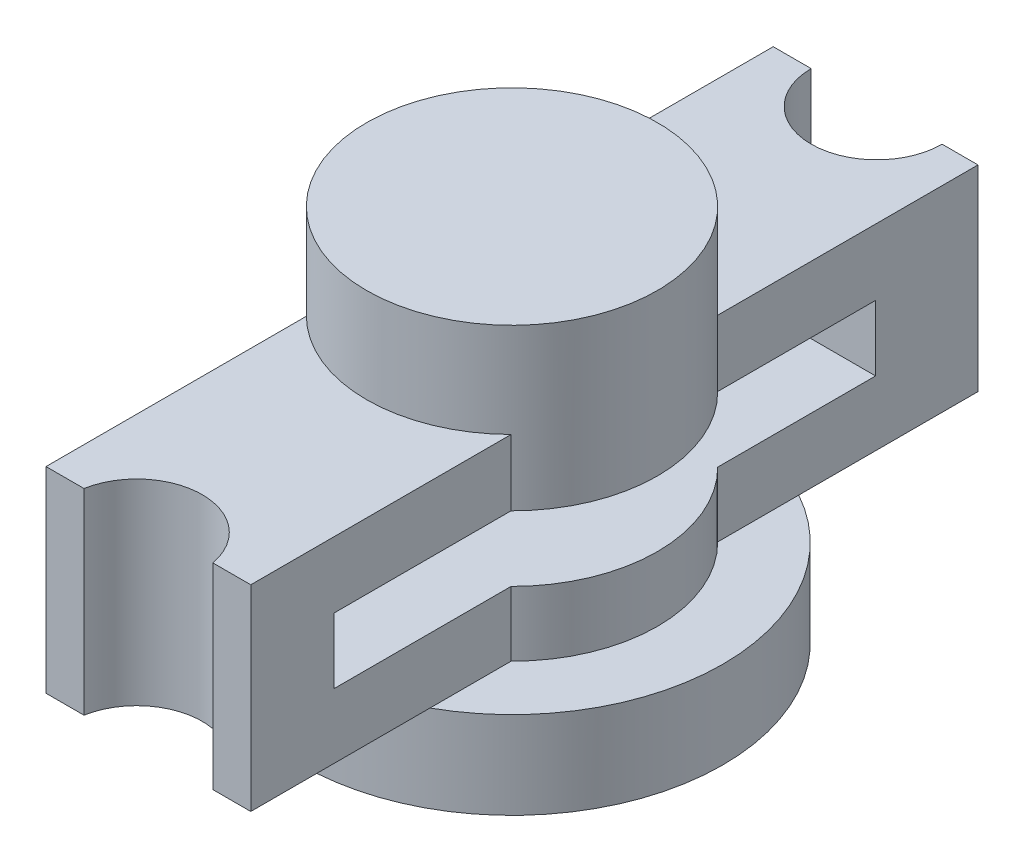
ISO-10303-21;
HEADER;
FILE_DESCRIPTION(('STEP AP214'),'2;1');
FILE_NAME('part.step','',(''),(''),'','','');
FILE_SCHEMA(('AUTOMOTIVE_DESIGN { 1 0 10303 214 1 1 1 1 }'));
ENDSEC;
DATA;
#1=APPLICATION_CONTEXT('core data for automotive mechanical design processes');
#2=APPLICATION_PROTOCOL_DEFINITION('international standard','automotive_design',2000,#1);
#3=PRODUCT_CONTEXT('',#1,'mechanical');
#4=PRODUCT('Part','Part','',(#3));
#5=PRODUCT_RELATED_PRODUCT_CATEGORY('part','',(#4));
#6=PRODUCT_DEFINITION_FORMATION('','',#4);
#7=PRODUCT_DEFINITION_CONTEXT('part definition',#1,'design');
#8=PRODUCT_DEFINITION('design','',#6,#7);
#9=PRODUCT_DEFINITION_SHAPE('','',#8);
#10=(LENGTH_UNIT() NAMED_UNIT(*) SI_UNIT(.MILLI.,.METRE.));
#11=(NAMED_UNIT(*) PLANE_ANGLE_UNIT() SI_UNIT($,.RADIAN.));
#12=(NAMED_UNIT(*) SI_UNIT($,.STERADIAN.) SOLID_ANGLE_UNIT());
#13=UNCERTAINTY_MEASURE_WITH_UNIT(LENGTH_MEASURE(1.E-05),#10,'distance_accuracy_value','');
#14=(GEOMETRIC_REPRESENTATION_CONTEXT(3) GLOBAL_UNCERTAINTY_ASSIGNED_CONTEXT((#13)) GLOBAL_UNIT_ASSIGNED_CONTEXT((#10,
#11,#12)) REPRESENTATION_CONTEXT('',''));
#15=CARTESIAN_POINT('',(0.,0.,0.));
#16=DIRECTION('',(0.,0.,1.));
#17=DIRECTION('',(1.,0.,0.));
#18=AXIS2_PLACEMENT_3D('',#15,#16,#17);
#19=CARTESIAN_POINT('',(0.,-52.,-1.04070291371448));
#20=DIRECTION('',(0.,1.,0.));
#21=DIRECTION('',(0.,0.,1.));
#22=AXIS2_PLACEMENT_3D('',#19,#20,#21);
#23=CYLINDRICAL_SURFACE('',#22,20.);
#24=DIRECTION('',(0.,-1.,0.));
#25=VECTOR('',#24,1.);
#26=CARTESIAN_POINT('',(14.0782722340498,-25.,13.1650089974846));
#27=LINE('',#26,#25);
#28=CARTESIAN_POINT('',(14.0782722340498,-25.,13.1650089974846));
#29=VERTEX_POINT('',#28);
#30=CARTESIAN_POINT('',(14.0782722340498,-34.0910702402835,13.1650089974846));
#31=VERTEX_POINT('',#30);
#32=EDGE_CURVE('E192',#29,#31,#27,.T.);
#33=ORIENTED_EDGE('',*,*,#32,.T.);
#34=CARTESIAN_POINT('',(0.,-34.0910702402835,-1.04070291371448));
#35=DIRECTION('',(0.,-1.,0.));
#36=DIRECTION('',(0.,0.,-1.));
#37=AXIS2_PLACEMENT_3D('',#34,#35,#36);
#38=CIRCLE('',#37,20.);
#39=CARTESIAN_POINT('',(14.0782722340497,-34.0910702402835,-15.2464148249136));
#40=VERTEX_POINT('',#39);
#41=EDGE_CURVE('E55',#31,#40,#38,.F.);
#42=ORIENTED_EDGE('',*,*,#41,.T.);
#43=DIRECTION('',(0.,-1.,0.));
#44=VECTOR('',#43,1.);
#45=CARTESIAN_POINT('',(14.0782722340498,-25.,-15.2464148249136));
#46=LINE('',#45,#44);
#47=CARTESIAN_POINT('',(14.0782722340498,-25.,-15.2464148249136));
#48=VERTEX_POINT('',#47);
#49=EDGE_CURVE('E189',#48,#40,#46,.T.);
#50=ORIENTED_EDGE('',*,*,#49,.F.);
#51=CARTESIAN_POINT('',(0.,-25.,-1.04070291371448));
#52=DIRECTION('',(0.,1.,0.));
#53=DIRECTION('',(0.,0.,1.));
#54=AXIS2_PLACEMENT_3D('',#51,#52,#53);
#55=CIRCLE('',#54,20.);
#56=CARTESIAN_POINT('',(-14.0782722340498,-25.,-15.2464148249136));
#57=VERTEX_POINT('',#56);
#58=EDGE_CURVE('E290',#57,#48,#55,.F.);
#59=ORIENTED_EDGE('',*,*,#58,.F.);
#60=DIRECTION('',(0.,-1.,0.));
#61=VECTOR('',#60,1.);
#62=CARTESIAN_POINT('',(-14.0782722340498,-25.,-15.2464148249136));
#63=LINE('',#62,#61);
#64=CARTESIAN_POINT('',(-14.0782722340498,-34.0910702402835,-15.2464148249136));
#65=VERTEX_POINT('',#64);
#66=EDGE_CURVE('E213',#57,#65,#63,.T.);
#67=ORIENTED_EDGE('',*,*,#66,.T.);
#68=CARTESIAN_POINT('',(0.,-34.0910702402835,-1.04070291371448));
#69=DIRECTION('',(0.,1.,0.));
#70=DIRECTION('',(0.,0.,1.));
#71=AXIS2_PLACEMENT_3D('',#68,#69,#70);
#72=CIRCLE('',#71,20.);
#73=CARTESIAN_POINT('',(-14.0782722340498,-34.0910702402835,13.1650089974846));
#74=VERTEX_POINT('',#73);
#75=EDGE_CURVE('E62',#74,#65,#72,.F.);
#76=ORIENTED_EDGE('',*,*,#75,.F.);
#77=DIRECTION('',(0.,-1.,0.));
#78=VECTOR('',#77,1.);
#79=CARTESIAN_POINT('',(-14.0782722340498,-25.,13.1650089974846));
#80=LINE('',#79,#78);
#81=CARTESIAN_POINT('',(-14.0782722340498,-25.,13.1650089974846));
#82=VERTEX_POINT('',#81);
#83=EDGE_CURVE('E258',#82,#74,#80,.T.);
#84=ORIENTED_EDGE('',*,*,#83,.F.);
#85=CARTESIAN_POINT('',(0.,-25.,-1.04070291371448));
#86=DIRECTION('',(0.,1.,0.));
#87=DIRECTION('',(0.,0.,1.));
#88=AXIS2_PLACEMENT_3D('',#85,#86,#87);
#89=CIRCLE('',#88,20.);
#90=EDGE_CURVE('E285',#29,#82,#89,.F.);
#91=ORIENTED_EDGE('',*,*,#90,.F.);
#92=EDGE_LOOP('',(#33,#42,#50,#59,#67,#76,#84,#91));
#93=FACE_BOUND('',#92,.T.);
#94=CARTESIAN_POINT('',(0.,-12.,-1.04070291371448));
#95=DIRECTION('',(0.,1.,0.));
#96=DIRECTION('',(0.,0.,1.));
#97=AXIS2_PLACEMENT_3D('',#94,#95,#96);
#98=CIRCLE('',#97,20.);
#99=CARTESIAN_POINT('',(0.,-12.,18.9592970862855));
#100=VERTEX_POINT('',#99);
#101=EDGE_CURVE('E43',#100,#100,#98,.F.);
#102=ORIENTED_EDGE('',*,*,#101,.T.);
#103=EDGE_LOOP('',(#102));
#104=FACE_BOUND('',#103,.T.);
#105=ADVANCED_FACE('F39',(#93,#104),#23,.T.);
#106=CARTESIAN_POINT('',(14.0782722340498,-43.0910702402835,-15.2464148249136));
#107=VERTEX_POINT('',#106);
#108=CARTESIAN_POINT('',(14.0782722340498,-52.,-15.2464148249136));
#109=VERTEX_POINT('',#108);
#110=EDGE_CURVE('E211',#107,#109,#46,.T.);
#111=ORIENTED_EDGE('',*,*,#110,.F.);
#112=CARTESIAN_POINT('',(0.,-43.0910702402835,-1.04070291371448));
#113=DIRECTION('',(0.,1.,0.));
#114=DIRECTION('',(0.,0.,1.));
#115=AXIS2_PLACEMENT_3D('',#112,#113,#114);
#116=CIRCLE('',#115,20.);
#117=CARTESIAN_POINT('',(14.0782722340497,-43.0910702402835,13.1650089974846));
#118=VERTEX_POINT('',#117);
#119=EDGE_CURVE('E193',#107,#118,#116,.F.);
#120=ORIENTED_EDGE('',*,*,#119,.T.);
#121=CARTESIAN_POINT('',(14.0782722340498,-52.,13.1650089974846));
#122=VERTEX_POINT('',#121);
#123=EDGE_CURVE('E261',#118,#122,#27,.T.);
#124=ORIENTED_EDGE('',*,*,#123,.T.);
#125=CARTESIAN_POINT('',(0.,-52.,-1.04070291371448));
#126=DIRECTION('',(0.,1.,0.));
#127=DIRECTION('',(0.,0.,1.));
#128=AXIS2_PLACEMENT_3D('',#125,#126,#127);
#129=CIRCLE('',#128,20.);
#130=EDGE_CURVE('E279',#122,#109,#129,.T.);
#131=ORIENTED_EDGE('',*,*,#130,.T.);
#132=EDGE_LOOP('',(#111,#120,#124,#131));
#133=FACE_BOUND('',#132,.T.);
#134=ADVANCED_FACE('F41',(#133),#23,.T.);
#135=CARTESIAN_POINT('',(0.,-43.0910702402835,-1.04070291371448));
#136=DIRECTION('',(0.,-1.,0.));
#137=DIRECTION('',(0.,0.,-1.));
#138=AXIS2_PLACEMENT_3D('',#135,#136,#137);
#139=CIRCLE('',#138,20.);
#140=CARTESIAN_POINT('',(-14.0782722340498,-43.0910702402835,-15.2464148249136));
#141=VERTEX_POINT('',#140);
#142=CARTESIAN_POINT('',(-14.0782722340498,-43.0910702402835,13.1650089974846));
#143=VERTEX_POINT('',#142);
#144=EDGE_CURVE('E336',#141,#143,#139,.F.);
#145=ORIENTED_EDGE('',*,*,#144,.F.);
#146=CARTESIAN_POINT('',(-14.0782722340498,-52.,-15.2464148249136));
#147=VERTEX_POINT('',#146);
#148=EDGE_CURVE('E210',#141,#147,#63,.T.);
#149=ORIENTED_EDGE('',*,*,#148,.T.);
#150=CARTESIAN_POINT('',(-14.0782722340498,-52.,13.1650089974846));
#151=VERTEX_POINT('',#150);
#152=EDGE_CURVE('E274',#147,#151,#129,.T.);
#153=ORIENTED_EDGE('',*,*,#152,.T.);
#154=EDGE_CURVE('E257',#143,#151,#80,.T.);
#155=ORIENTED_EDGE('',*,*,#154,.F.);
#156=EDGE_LOOP('',(#145,#149,#153,#155));
#157=FACE_BOUND('',#156,.T.);
#158=ADVANCED_FACE('F385',(#157),#23,.T.);
#159=CARTESIAN_POINT('',(0.,-52.,-1.04070291371448));
#160=DIRECTION('',(0.,-1.,0.));
#161=DIRECTION('',(0.,0.,-1.));
#162=AXIS2_PLACEMENT_3D('',#159,#160,#161);
#163=PLANE('',#162);
#164=DIRECTION('',(0.,0.,1.));
#165=VECTOR('',#164,1.);
#166=CARTESIAN_POINT('',(-14.0782722340498,-52.,-1.04070291371448));
#167=LINE('',#166,#165);
#168=CARTESIAN_POINT('',(-14.0782722340498,-52.,-26.3942480485469));
#169=VERTEX_POINT('',#168);
#170=EDGE_CURVE('E287',#169,#147,#167,.T.);
#171=ORIENTED_EDGE('',*,*,#170,.F.);
#172=CARTESIAN_POINT('',(0.,-52.,-1.04070291371448));
#173=DIRECTION('',(0.,-1.,0.));
#174=DIRECTION('',(0.,0.,-1.));
#175=AXIS2_PLACEMENT_3D('',#172,#173,#174);
#176=CIRCLE('',#175,29.);
#177=CARTESIAN_POINT('',(-14.0782722340498,-52.,24.3128422211179));
#178=VERTEX_POINT('',#177);
#179=EDGE_CURVE('E278',#178,#169,#176,.T.);
#180=ORIENTED_EDGE('',*,*,#179,.F.);
#181=DIRECTION('',(0.,0.,-1.));
#182=VECTOR('',#181,1.);
#183=CARTESIAN_POINT('',(-14.0782722340498,-52.,-1.04070291371448));
#184=LINE('',#183,#182);
#185=EDGE_CURVE('E282',#178,#151,#184,.T.);
#186=ORIENTED_EDGE('',*,*,#185,.T.);
#187=ORIENTED_EDGE('',*,*,#152,.F.);
#188=EDGE_LOOP('',(#171,#180,#186,#187));
#189=FACE_BOUND('',#188,.T.);
#190=ADVANCED_FACE('F387',(#189),#163,.F.);
#191=DIRECTION('',(0.,0.,-1.));
#192=VECTOR('',#191,1.);
#193=CARTESIAN_POINT('',(14.0782722340498,-52.,0.));
#194=LINE('',#193,#192);
#195=CARTESIAN_POINT('',(14.0782722340498,-52.,-26.3942480485469));
#196=VERTEX_POINT('',#195);
#197=EDGE_CURVE('E308',#109,#196,#194,.T.);
#198=ORIENTED_EDGE('',*,*,#197,.F.);
#199=ORIENTED_EDGE('',*,*,#130,.F.);
#200=DIRECTION('',(0.,0.,1.));
#201=VECTOR('',#200,1.);
#202=CARTESIAN_POINT('',(14.0782722340498,-52.,0.));
#203=LINE('',#202,#201);
#204=CARTESIAN_POINT('',(14.0782722340498,-52.,24.3128422211179));
#205=VERTEX_POINT('',#204);
#206=EDGE_CURVE('E250',#122,#205,#203,.T.);
#207=ORIENTED_EDGE('',*,*,#206,.T.);
#208=EDGE_CURVE('E270',#196,#205,#176,.T.);
#209=ORIENTED_EDGE('',*,*,#208,.F.);
#210=EDGE_LOOP('',(#198,#199,#207,#209));
#211=FACE_BOUND('',#210,.T.);
#212=ADVANCED_FACE('F306',(#211),#163,.F.);
#213=CARTESIAN_POINT('',(0.,-64.,-1.04070291371448));
#214=DIRECTION('',(0.,1.,0.));
#215=DIRECTION('',(0.,0.,1.));
#216=AXIS2_PLACEMENT_3D('',#213,#214,#215);
#217=CYLINDRICAL_SURFACE('',#216,29.);
#218=CARTESIAN_POINT('',(0.,-64.,-1.04070291371448));
#219=DIRECTION('',(0.,-1.,0.));
#220=DIRECTION('',(0.,0.,-1.));
#221=AXIS2_PLACEMENT_3D('',#218,#219,#220);
#222=CIRCLE('',#221,29.);
#223=CARTESIAN_POINT('',(0.,-64.,-30.0407029137145));
#224=VERTEX_POINT('',#223);
#225=EDGE_CURVE('E271',#224,#224,#222,.T.);
#226=ORIENTED_EDGE('',*,*,#225,.F.);
#227=EDGE_LOOP('',(#226));
#228=FACE_BOUND('',#227,.T.);
#229=EDGE_CURVE('E275',#205,#178,#176,.T.);
#230=ORIENTED_EDGE('',*,*,#229,.T.);
#231=ORIENTED_EDGE('',*,*,#179,.T.);
#232=EDGE_CURVE('E447',#169,#196,#176,.T.);
#233=ORIENTED_EDGE('',*,*,#232,.T.);
#234=ORIENTED_EDGE('',*,*,#208,.T.);
#235=EDGE_LOOP('',(#230,#231,#233,#234));
#236=FACE_BOUND('',#235,.T.);
#237=ADVANCED_FACE('F437',(#228,#236),#217,.T.);
#238=CARTESIAN_POINT('',(0.,-64.,-1.04070291371448));
#239=DIRECTION('',(0.,-1.,0.));
#240=DIRECTION('',(0.,0.,-1.));
#241=AXIS2_PLACEMENT_3D('',#238,#239,#240);
#242=PLANE('',#241);
#243=ORIENTED_EDGE('',*,*,#225,.T.);
#244=EDGE_LOOP('',(#243));
#245=FACE_BOUND('',#244,.T.);
#246=ADVANCED_FACE('F421',(#245),#242,.T.);
#247=CARTESIAN_POINT('',(0.,-25.,48.9592970862855));
#248=DIRECTION('',(0.,0.,1.));
#249=DIRECTION('',(1.,0.,0.));
#250=AXIS2_PLACEMENT_3D('',#247,#248,#249);
#251=PLANE('',#250);
#252=DIRECTION('',(-1.,0.,0.));
#253=VECTOR('',#252,1.);
#254=CARTESIAN_POINT('',(0.,-52.,48.9592970862855));
#255=LINE('',#254,#253);
#256=CARTESIAN_POINT('',(-8.85577506839375,-52.,48.9592970862855));
#257=VERTEX_POINT('',#256);
#258=CARTESIAN_POINT('',(-14.0782722340498,-52.,48.9592970862855));
#259=VERTEX_POINT('',#258);
#260=EDGE_CURVE('E229',#257,#259,#255,.T.);
#261=ORIENTED_EDGE('',*,*,#260,.F.);
#262=DIRECTION('',(0.,-1.,0.));
#263=VECTOR('',#262,1.);
#264=CARTESIAN_POINT('',(-8.85577506839375,-25.,48.9592970862855));
#265=LINE('',#264,#263);
#266=CARTESIAN_POINT('',(-8.85577506839375,-25.,48.9592970862855));
#267=VERTEX_POINT('',#266);
#268=EDGE_CURVE('E268',#267,#257,#265,.T.);
#269=ORIENTED_EDGE('',*,*,#268,.F.);
#270=DIRECTION('',(-1.,0.,0.));
#271=VECTOR('',#270,1.);
#272=CARTESIAN_POINT('',(0.,-25.,48.9592970862855));
#273=LINE('',#272,#271);
#274=CARTESIAN_POINT('',(-14.0782722340498,-25.,48.9592970862855));
#275=VERTEX_POINT('',#274);
#276=EDGE_CURVE('E230',#267,#275,#273,.T.);
#277=ORIENTED_EDGE('',*,*,#276,.T.);
#278=DIRECTION('',(0.,-1.,0.));
#279=VECTOR('',#278,1.);
#280=CARTESIAN_POINT('',(-14.0782722340498,-25.,48.9592970862855));
#281=LINE('',#280,#279);
#282=EDGE_CURVE('E243',#275,#259,#281,.T.);
#283=ORIENTED_EDGE('',*,*,#282,.T.);
#284=EDGE_LOOP('',(#261,#269,#277,#283));
#285=FACE_BOUND('',#284,.T.);
#286=ADVANCED_FACE('F399',(#285),#251,.T.);
#287=CARTESIAN_POINT('',(0.00124858282800865,-25.,50.557149407903));
#288=DIRECTION('',(0.,-1.,0.));
#289=DIRECTION('',(0.,0.,-1.));
#290=AXIS2_PLACEMENT_3D('',#287,#288,#289);
#291=CYLINDRICAL_SURFACE('',#290,9.);
#292=CARTESIAN_POINT('',(0.00124858282800865,-52.,50.557149407903));
#293=DIRECTION('',(0.,1.,0.));
#294=DIRECTION('',(0.,0.,1.));
#295=AXIS2_PLACEMENT_3D('',#292,#293,#294);
#296=CIRCLE('',#295,9.);
#297=CARTESIAN_POINT('',(8.85827223404976,-52.,48.9592970862855));
#298=VERTEX_POINT('',#297);
#299=EDGE_CURVE('E246',#257,#298,#296,.F.);
#300=ORIENTED_EDGE('',*,*,#299,.T.);
#301=DIRECTION('',(0.,-1.,0.));
#302=VECTOR('',#301,1.);
#303=CARTESIAN_POINT('',(8.85827223404976,-25.,48.9592970862855));
#304=LINE('',#303,#302);
#305=CARTESIAN_POINT('',(8.85827223404976,-25.,48.9592970862855));
#306=VERTEX_POINT('',#305);
#307=EDGE_CURVE('E266',#306,#298,#304,.T.);
#308=ORIENTED_EDGE('',*,*,#307,.F.);
#309=CARTESIAN_POINT('',(0.00124858282800865,-25.,50.557149407903));
#310=DIRECTION('',(0.,1.,0.));
#311=DIRECTION('',(0.,0.,1.));
#312=AXIS2_PLACEMENT_3D('',#309,#310,#311);
#313=CIRCLE('',#312,9.);
#314=EDGE_CURVE('E233',#267,#306,#313,.F.);
#315=ORIENTED_EDGE('',*,*,#314,.F.);
#316=ORIENTED_EDGE('',*,*,#268,.T.);
#317=EDGE_LOOP('',(#300,#308,#315,#316));
#318=FACE_BOUND('',#317,.T.);
#319=ADVANCED_FACE('F413',(#318),#291,.F.);
#320=CARTESIAN_POINT('',(14.0782722340498,-52.,48.9592970862855));
#321=VERTEX_POINT('',#320);
#322=EDGE_CURVE('E247',#321,#298,#255,.T.);
#323=ORIENTED_EDGE('',*,*,#322,.F.);
#324=DIRECTION('',(0.,-1.,0.));
#325=VECTOR('',#324,1.);
#326=CARTESIAN_POINT('',(14.0782722340498,-25.,48.9592970862855));
#327=LINE('',#326,#325);
#328=CARTESIAN_POINT('',(14.0782722340498,-25.,48.9592970862855));
#329=VERTEX_POINT('',#328);
#330=EDGE_CURVE('E263',#329,#321,#327,.T.);
#331=ORIENTED_EDGE('',*,*,#330,.F.);
#332=EDGE_CURVE('E235',#329,#306,#273,.T.);
#333=ORIENTED_EDGE('',*,*,#332,.T.);
#334=ORIENTED_EDGE('',*,*,#307,.T.);
#335=EDGE_LOOP('',(#323,#331,#333,#334));
#336=FACE_BOUND('',#335,.T.);
#337=ADVANCED_FACE('F410',(#336),#251,.T.);
#338=CARTESIAN_POINT('',(14.0782722340498,-25.,0.));
#339=DIRECTION('',(1.,0.,0.));
#340=DIRECTION('',(0.,0.,-1.));
#341=AXIS2_PLACEMENT_3D('',#338,#339,#340);
#342=PLANE('',#341);
#343=DIRECTION('',(0.,0.,-1.));
#344=VECTOR('',#343,1.);
#345=CARTESIAN_POINT('',(14.0782722340498,-43.0910702402835,37.4842364280276));
#346=LINE('',#345,#344);
#347=CARTESIAN_POINT('',(14.0782722340498,-43.0910702402835,37.4842364280276));
#348=VERTEX_POINT('',#347);
#349=EDGE_CURVE('E354',#348,#118,#346,.T.);
#350=ORIENTED_EDGE('',*,*,#349,.F.);
#351=DIRECTION('',(0.,-1.,0.));
#352=VECTOR('',#351,1.);
#353=CARTESIAN_POINT('',(14.0782722340498,-34.0910702402835,37.4842364280276));
#354=LINE('',#353,#352);
#355=CARTESIAN_POINT('',(14.0782722340498,-34.0910702402835,37.4842364280276));
#356=VERTEX_POINT('',#355);
#357=EDGE_CURVE('E203',#356,#348,#354,.T.);
#358=ORIENTED_EDGE('',*,*,#357,.F.);
#359=DIRECTION('',(0.,0.,1.));
#360=VECTOR('',#359,1.);
#361=CARTESIAN_POINT('',(14.0782722340498,-34.0910702402835,13.1650089974846));
#362=LINE('',#361,#360);
#363=EDGE_CURVE('E204',#31,#356,#362,.T.);
#364=ORIENTED_EDGE('',*,*,#363,.F.);
#365=ORIENTED_EDGE('',*,*,#32,.F.);
#366=DIRECTION('',(0.,0.,1.));
#367=VECTOR('',#366,1.);
#368=CARTESIAN_POINT('',(14.0782722340498,-25.,0.));
#369=LINE('',#368,#367);
#370=EDGE_CURVE('E237',#29,#329,#369,.T.);
#371=ORIENTED_EDGE('',*,*,#370,.T.);
#372=ORIENTED_EDGE('',*,*,#330,.T.);
#373=EDGE_CURVE('E253',#205,#321,#203,.T.);
#374=ORIENTED_EDGE('',*,*,#373,.F.);
#375=ORIENTED_EDGE('',*,*,#206,.F.);
#376=ORIENTED_EDGE('',*,*,#123,.F.);
#377=EDGE_LOOP('',(#350,#358,#364,#365,#371,#372,#374,#375,#376));
#378=FACE_BOUND('',#377,.T.);
#379=ADVANCED_FACE('F363',(#378),#342,.T.);
#380=CARTESIAN_POINT('',(-14.0782722340498,-25.,0.));
#381=DIRECTION('',(-1.,0.,0.));
#382=DIRECTION('',(0.,0.,1.));
#383=AXIS2_PLACEMENT_3D('',#380,#381,#382);
#384=PLANE('',#383);
#385=DIRECTION('',(0.,0.,1.));
#386=VECTOR('',#385,1.);
#387=CARTESIAN_POINT('',(-14.0782722340498,-43.0910702402835,0.));
#388=LINE('',#387,#386);
#389=CARTESIAN_POINT('',(-14.0782722340498,-43.0910702402835,37.4842364280276));
#390=VERTEX_POINT('',#389);
#391=EDGE_CURVE('E334',#143,#390,#388,.T.);
#392=ORIENTED_EDGE('',*,*,#391,.F.);
#393=ORIENTED_EDGE('',*,*,#154,.T.);
#394=ORIENTED_EDGE('',*,*,#185,.F.);
#395=DIRECTION('',(0.,0.,-1.));
#396=VECTOR('',#395,1.);
#397=CARTESIAN_POINT('',(-14.0782722340498,-52.,0.));
#398=LINE('',#397,#396);
#399=EDGE_CURVE('E234',#259,#178,#398,.T.);
#400=ORIENTED_EDGE('',*,*,#399,.F.);
#401=ORIENTED_EDGE('',*,*,#282,.F.);
#402=DIRECTION('',(0.,0.,-1.));
#403=VECTOR('',#402,1.);
#404=CARTESIAN_POINT('',(-14.0782722340498,-25.,0.));
#405=LINE('',#404,#403);
#406=EDGE_CURVE('E240',#275,#82,#405,.T.);
#407=ORIENTED_EDGE('',*,*,#406,.T.);
#408=ORIENTED_EDGE('',*,*,#83,.T.);
#409=DIRECTION('',(0.,0.,-1.));
#410=VECTOR('',#409,1.);
#411=CARTESIAN_POINT('',(-14.0782722340498,-34.0910702402835,0.));
#412=LINE('',#411,#410);
#413=CARTESIAN_POINT('',(-14.0782722340498,-34.0910702402835,37.4842364280276));
#414=VERTEX_POINT('',#413);
#415=EDGE_CURVE('E341',#414,#74,#412,.T.);
#416=ORIENTED_EDGE('',*,*,#415,.F.);
#417=DIRECTION('',(0.,1.,0.));
#418=VECTOR('',#417,1.);
#419=CARTESIAN_POINT('',(-14.0782722340498,-25.,37.4842364280276));
#420=LINE('',#419,#418);
#421=EDGE_CURVE('E11',#390,#414,#420,.T.);
#422=ORIENTED_EDGE('',*,*,#421,.F.);
#423=EDGE_LOOP('',(#392,#393,#394,#400,#401,#407,#408,#416,#422));
#424=FACE_BOUND('',#423,.T.);
#425=ADVANCED_FACE('F370',(#424),#384,.T.);
#426=CARTESIAN_POINT('',(0.,-25.,0.));
#427=DIRECTION('',(0.,1.,0.));
#428=DIRECTION('',(0.,0.,1.));
#429=AXIS2_PLACEMENT_3D('',#426,#427,#428);
#430=PLANE('',#429);
#431=ORIENTED_EDGE('',*,*,#370,.F.);
#432=ORIENTED_EDGE('',*,*,#90,.T.);
#433=ORIENTED_EDGE('',*,*,#406,.F.);
#434=ORIENTED_EDGE('',*,*,#276,.F.);
#435=ORIENTED_EDGE('',*,*,#314,.T.);
#436=ORIENTED_EDGE('',*,*,#332,.F.);
#437=EDGE_LOOP('',(#431,#432,#433,#434,#435,#436));
#438=FACE_BOUND('',#437,.T.);
#439=ADVANCED_FACE('F405',(#438),#430,.T.);
#440=CARTESIAN_POINT('',(0.,-52.,0.));
#441=DIRECTION('',(0.,1.,0.));
#442=DIRECTION('',(0.,0.,1.));
#443=AXIS2_PLACEMENT_3D('',#440,#441,#442);
#444=PLANE('',#443);
#445=ORIENTED_EDGE('',*,*,#399,.T.);
#446=ORIENTED_EDGE('',*,*,#229,.F.);
#447=ORIENTED_EDGE('',*,*,#373,.T.);
#448=ORIENTED_EDGE('',*,*,#322,.T.);
#449=ORIENTED_EDGE('',*,*,#299,.F.);
#450=ORIENTED_EDGE('',*,*,#260,.T.);
#451=EDGE_LOOP('',(#445,#446,#447,#448,#449,#450));
#452=FACE_BOUND('',#451,.T.);
#453=ADVANCED_FACE('F393',(#452),#444,.F.);
#454=CARTESIAN_POINT('',(0.,-25.,-51.0407029137145));
#455=DIRECTION('',(0.,0.,1.));
#456=DIRECTION('',(1.,0.,0.));
#457=AXIS2_PLACEMENT_3D('',#454,#455,#456);
#458=PLANE('',#457);
#459=DIRECTION('',(-1.,0.,0.));
#460=VECTOR('',#459,1.);
#461=CARTESIAN_POINT('',(0.,-52.,-51.0407029137145));
#462=LINE('',#461,#460);
#463=CARTESIAN_POINT('',(14.0782722340498,-52.,-51.0407029137145));
#464=VERTEX_POINT('',#463);
#465=CARTESIAN_POINT('',(9.14422493160625,-52.,-51.0407029137145));
#466=VERTEX_POINT('',#465);
#467=EDGE_CURVE('E323',#464,#466,#462,.T.);
#468=ORIENTED_EDGE('',*,*,#467,.T.);
#469=DIRECTION('',(0.,-1.,0.));
#470=VECTOR('',#469,1.);
#471=CARTESIAN_POINT('',(9.14422493160625,-25.,-51.0407029137145));
#472=LINE('',#471,#470);
#473=CARTESIAN_POINT('',(9.14422493160625,-25.,-51.0407029137145));
#474=VERTEX_POINT('',#473);
#475=EDGE_CURVE('E226',#474,#466,#472,.T.);
#476=ORIENTED_EDGE('',*,*,#475,.F.);
#477=DIRECTION('',(-1.,0.,0.));
#478=VECTOR('',#477,1.);
#479=CARTESIAN_POINT('',(0.,-25.,-51.0407029137145));
#480=LINE('',#479,#478);
#481=CARTESIAN_POINT('',(14.0782722340498,-25.,-51.0407029137145));
#482=VERTEX_POINT('',#481);
#483=EDGE_CURVE('E310',#482,#474,#480,.T.);
#484=ORIENTED_EDGE('',*,*,#483,.F.);
#485=DIRECTION('',(0.,-1.,0.));
#486=VECTOR('',#485,1.);
#487=CARTESIAN_POINT('',(14.0782722340498,-25.,-51.0407029137145));
#488=LINE('',#487,#486);
#489=EDGE_CURVE('E215',#482,#464,#488,.T.);
#490=ORIENTED_EDGE('',*,*,#489,.T.);
#491=EDGE_LOOP('',(#468,#476,#484,#490));
#492=FACE_BOUND('',#491,.T.);
#493=ADVANCED_FACE('F464',(#492),#458,.F.);
#494=CARTESIAN_POINT('',(0.144224931606254,-25.,-51.0407029137145));
#495=DIRECTION('',(0.,-1.,0.));
#496=DIRECTION('',(0.,0.,-1.));
#497=AXIS2_PLACEMENT_3D('',#494,#495,#496);
#498=CYLINDRICAL_SURFACE('',#497,9.);
#499=CARTESIAN_POINT('',(0.144224931606254,-52.,-51.0407029137145));
#500=DIRECTION('',(0.,1.,0.));
#501=DIRECTION('',(0.,0.,1.));
#502=AXIS2_PLACEMENT_3D('',#499,#500,#501);
#503=CIRCLE('',#502,9.);
#504=CARTESIAN_POINT('',(-8.85577506839375,-52.,-51.0407029137145));
#505=VERTEX_POINT('',#504);
#506=EDGE_CURVE('E321',#466,#505,#503,.F.);
#507=ORIENTED_EDGE('',*,*,#506,.T.);
#508=DIRECTION('',(0.,-1.,0.));
#509=VECTOR('',#508,1.);
#510=CARTESIAN_POINT('',(-8.85577506839375,-25.,-51.0407029137145));
#511=LINE('',#510,#509);
#512=CARTESIAN_POINT('',(-8.85577506839375,-25.,-51.0407029137145));
#513=VERTEX_POINT('',#512);
#514=EDGE_CURVE('E223',#513,#505,#511,.T.);
#515=ORIENTED_EDGE('',*,*,#514,.F.);
#516=CARTESIAN_POINT('',(0.144224931606254,-25.,-51.0407029137145));
#517=DIRECTION('',(0.,1.,0.));
#518=DIRECTION('',(0.,0.,1.));
#519=AXIS2_PLACEMENT_3D('',#516,#517,#518);
#520=CIRCLE('',#519,9.);
#521=EDGE_CURVE('E313',#474,#513,#520,.F.);
#522=ORIENTED_EDGE('',*,*,#521,.F.);
#523=ORIENTED_EDGE('',*,*,#475,.T.);
#524=EDGE_LOOP('',(#507,#515,#522,#523));
#525=FACE_BOUND('',#524,.T.);
#526=ADVANCED_FACE('F460',(#525),#498,.F.);
#527=CARTESIAN_POINT('',(-14.0782722340498,-52.,-51.0407029137145));
#528=VERTEX_POINT('',#527);
#529=EDGE_CURVE('E320',#505,#528,#462,.T.);
#530=ORIENTED_EDGE('',*,*,#529,.T.);
#531=DIRECTION('',(0.,-1.,0.));
#532=VECTOR('',#531,1.);
#533=CARTESIAN_POINT('',(-14.0782722340498,-25.,-51.0407029137145));
#534=LINE('',#533,#532);
#535=CARTESIAN_POINT('',(-14.0782722340498,-25.,-51.0407029137145));
#536=VERTEX_POINT('',#535);
#537=EDGE_CURVE('E220',#536,#528,#534,.T.);
#538=ORIENTED_EDGE('',*,*,#537,.F.);
#539=EDGE_CURVE('E315',#513,#536,#480,.T.);
#540=ORIENTED_EDGE('',*,*,#539,.F.);
#541=ORIENTED_EDGE('',*,*,#514,.T.);
#542=EDGE_LOOP('',(#530,#538,#540,#541));
#543=FACE_BOUND('',#542,.T.);
#544=ADVANCED_FACE('F456',(#543),#458,.F.);
#545=CARTESIAN_POINT('',(-14.0782722340498,-25.,0.));
#546=DIRECTION('',(1.,0.,0.));
#547=DIRECTION('',(0.,0.,-1.));
#548=AXIS2_PLACEMENT_3D('',#545,#546,#547);
#549=PLANE('',#548);
#550=ORIENTED_EDGE('',*,*,#148,.F.);
#551=DIRECTION('',(0.,0.,-1.));
#552=VECTOR('',#551,1.);
#553=CARTESIAN_POINT('',(-14.0782722340498,-43.0910702402835,0.));
#554=LINE('',#553,#552);
#555=CARTESIAN_POINT('',(-14.0782722340498,-43.0910702402835,-36.957800207708));
#556=VERTEX_POINT('',#555);
#557=EDGE_CURVE('E338',#141,#556,#554,.T.);
#558=ORIENTED_EDGE('',*,*,#557,.T.);
#559=DIRECTION('',(0.,1.,0.));
#560=VECTOR('',#559,1.);
#561=CARTESIAN_POINT('',(-14.0782722340498,-25.,-36.957800207708));
#562=LINE('',#561,#560);
#563=CARTESIAN_POINT('',(-14.0782722340498,-34.0910702402835,-36.957800207708));
#564=VERTEX_POINT('',#563);
#565=EDGE_CURVE('E326',#556,#564,#562,.T.);
#566=ORIENTED_EDGE('',*,*,#565,.T.);
#567=DIRECTION('',(0.,0.,1.));
#568=VECTOR('',#567,1.);
#569=CARTESIAN_POINT('',(-14.0782722340498,-34.0910702402835,0.));
#570=LINE('',#569,#568);
#571=EDGE_CURVE('E344',#564,#65,#570,.T.);
#572=ORIENTED_EDGE('',*,*,#571,.T.);
#573=ORIENTED_EDGE('',*,*,#66,.F.);
#574=DIRECTION('',(0.,0.,1.));
#575=VECTOR('',#574,1.);
#576=CARTESIAN_POINT('',(-14.0782722340498,-25.,0.));
#577=LINE('',#576,#575);
#578=EDGE_CURVE('E328',#536,#57,#577,.T.);
#579=ORIENTED_EDGE('',*,*,#578,.F.);
#580=ORIENTED_EDGE('',*,*,#537,.T.);
#581=DIRECTION('',(0.,0.,1.));
#582=VECTOR('',#581,1.);
#583=CARTESIAN_POINT('',(-14.0782722340498,-52.,0.));
#584=LINE('',#583,#582);
#585=EDGE_CURVE('E316',#528,#169,#584,.T.);
#586=ORIENTED_EDGE('',*,*,#585,.T.);
#587=ORIENTED_EDGE('',*,*,#170,.T.);
#588=EDGE_LOOP('',(#550,#558,#566,#572,#573,#579,#580,#586,#587));
#589=FACE_BOUND('',#588,.T.);
#590=ADVANCED_FACE('F377',(#589),#549,.F.);
#591=CARTESIAN_POINT('',(14.0782722340498,-25.,0.));
#592=DIRECTION('',(-1.,0.,0.));
#593=DIRECTION('',(0.,0.,1.));
#594=AXIS2_PLACEMENT_3D('',#591,#592,#593);
#595=PLANE('',#594);
#596=DIRECTION('',(0.,1.,0.));
#597=VECTOR('',#596,1.);
#598=CARTESIAN_POINT('',(14.0782722340498,-43.0910702402835,-36.957800207708));
#599=LINE('',#598,#597);
#600=CARTESIAN_POINT('',(14.0782722340498,-43.0910702402835,-36.957800207708));
#601=VERTEX_POINT('',#600);
#602=CARTESIAN_POINT('',(14.0782722340498,-34.0910702402835,-36.957800207708));
#603=VERTEX_POINT('',#602);
#604=EDGE_CURVE('E297',#601,#603,#599,.T.);
#605=ORIENTED_EDGE('',*,*,#604,.F.);
#606=DIRECTION('',(0.,0.,1.));
#607=VECTOR('',#606,1.);
#608=CARTESIAN_POINT('',(14.0782722340498,-43.0910702402835,0.));
#609=LINE('',#608,#607);
#610=EDGE_CURVE('E48',#601,#107,#609,.T.);
#611=ORIENTED_EDGE('',*,*,#610,.T.);
#612=ORIENTED_EDGE('',*,*,#110,.T.);
#613=ORIENTED_EDGE('',*,*,#197,.T.);
#614=EDGE_CURVE('E311',#196,#464,#194,.T.);
#615=ORIENTED_EDGE('',*,*,#614,.T.);
#616=ORIENTED_EDGE('',*,*,#489,.F.);
#617=DIRECTION('',(0.,0.,-1.));
#618=VECTOR('',#617,1.);
#619=CARTESIAN_POINT('',(14.0782722340498,-25.,0.));
#620=LINE('',#619,#618);
#621=EDGE_CURVE('E209',#48,#482,#620,.T.);
#622=ORIENTED_EDGE('',*,*,#621,.F.);
#623=ORIENTED_EDGE('',*,*,#49,.T.);
#624=EDGE_CURVE('E197',#603,#40,#362,.T.);
#625=ORIENTED_EDGE('',*,*,#624,.F.);
#626=EDGE_LOOP('',(#605,#611,#612,#613,#615,#616,#622,#623,#625));
#627=FACE_BOUND('',#626,.T.);
#628=ADVANCED_FACE('F207',(#627),#595,.F.);
#629=CARTESIAN_POINT('',(0.,-25.,0.));
#630=DIRECTION('',(0.,1.,0.));
#631=DIRECTION('',(0.,0.,1.));
#632=AXIS2_PLACEMENT_3D('',#629,#630,#631);
#633=PLANE('',#632);
#634=ORIENTED_EDGE('',*,*,#578,.T.);
#635=ORIENTED_EDGE('',*,*,#58,.T.);
#636=ORIENTED_EDGE('',*,*,#621,.T.);
#637=ORIENTED_EDGE('',*,*,#483,.T.);
#638=ORIENTED_EDGE('',*,*,#521,.T.);
#639=ORIENTED_EDGE('',*,*,#539,.T.);
#640=EDGE_LOOP('',(#634,#635,#636,#637,#638,#639));
#641=FACE_BOUND('',#640,.T.);
#642=ADVANCED_FACE('F466',(#641),#633,.T.);
#643=CARTESIAN_POINT('',(0.,-52.,0.));
#644=DIRECTION('',(0.,1.,0.));
#645=DIRECTION('',(0.,0.,1.));
#646=AXIS2_PLACEMENT_3D('',#643,#644,#645);
#647=PLANE('',#646);
#648=ORIENTED_EDGE('',*,*,#614,.F.);
#649=ORIENTED_EDGE('',*,*,#232,.F.);
#650=ORIENTED_EDGE('',*,*,#585,.F.);
#651=ORIENTED_EDGE('',*,*,#529,.F.);
#652=ORIENTED_EDGE('',*,*,#506,.F.);
#653=ORIENTED_EDGE('',*,*,#467,.F.);
#654=EDGE_LOOP('',(#648,#649,#650,#651,#652,#653));
#655=FACE_BOUND('',#654,.T.);
#656=ADVANCED_FACE('F450',(#655),#647,.F.);
#657=CARTESIAN_POINT('',(-29.,-43.0910702402835,-36.957800207708));
#658=DIRECTION('',(0.,0.,-1.));
#659=DIRECTION('',(-1.,0.,0.));
#660=AXIS2_PLACEMENT_3D('',#657,#658,#659);
#661=PLANE('',#660);
#662=DIRECTION('',(1.,0.,0.));
#663=VECTOR('',#662,1.);
#664=CARTESIAN_POINT('',(-29.,-43.0910702402835,-36.957800207708));
#665=LINE('',#664,#663);
#666=EDGE_CURVE('E350',#556,#601,#665,.T.);
#667=ORIENTED_EDGE('',*,*,#666,.T.);
#668=ORIENTED_EDGE('',*,*,#604,.T.);
#669=DIRECTION('',(1.,0.,0.));
#670=VECTOR('',#669,1.);
#671=CARTESIAN_POINT('',(-29.,-34.0910702402835,-36.957800207708));
#672=LINE('',#671,#670);
#673=EDGE_CURVE('E200',#564,#603,#672,.T.);
#674=ORIENTED_EDGE('',*,*,#673,.F.);
#675=ORIENTED_EDGE('',*,*,#565,.F.);
#676=EDGE_LOOP('',(#667,#668,#674,#675));
#677=FACE_BOUND('',#676,.T.);
#678=ADVANCED_FACE('F379',(#677),#661,.F.);
#679=CARTESIAN_POINT('',(-29.,-43.0910702402835,37.4842364280276));
#680=DIRECTION('',(0.,-1.,0.));
#681=DIRECTION('',(0.,0.,-1.));
#682=AXIS2_PLACEMENT_3D('',#679,#680,#681);
#683=PLANE('',#682);
#684=ORIENTED_EDGE('',*,*,#144,.T.);
#685=ORIENTED_EDGE('',*,*,#391,.T.);
#686=DIRECTION('',(1.,0.,0.));
#687=VECTOR('',#686,1.);
#688=CARTESIAN_POINT('',(-29.,-43.0910702402835,37.4842364280276));
#689=LINE('',#688,#687);
#690=EDGE_CURVE('E348',#390,#348,#689,.T.);
#691=ORIENTED_EDGE('',*,*,#690,.T.);
#692=ORIENTED_EDGE('',*,*,#349,.T.);
#693=ORIENTED_EDGE('',*,*,#119,.F.);
#694=ORIENTED_EDGE('',*,*,#610,.F.);
#695=ORIENTED_EDGE('',*,*,#666,.F.);
#696=ORIENTED_EDGE('',*,*,#557,.F.);
#697=EDGE_LOOP('',(#684,#685,#691,#692,#693,#694,#695,#696));
#698=FACE_BOUND('',#697,.T.);
#699=ADVANCED_FACE('F380',(#698),#683,.F.);
#700=CARTESIAN_POINT('',(-29.,-34.0910702402835,37.4842364280276));
#701=DIRECTION('',(0.,0.,1.));
#702=DIRECTION('',(1.,0.,0.));
#703=AXIS2_PLACEMENT_3D('',#700,#701,#702);
#704=PLANE('',#703);
#705=ORIENTED_EDGE('',*,*,#421,.T.);
#706=DIRECTION('',(1.,0.,0.));
#707=VECTOR('',#706,1.);
#708=CARTESIAN_POINT('',(-29.,-34.0910702402835,37.4842364280276));
#709=LINE('',#708,#707);
#710=EDGE_CURVE('E346',#414,#356,#709,.T.);
#711=ORIENTED_EDGE('',*,*,#710,.T.);
#712=ORIENTED_EDGE('',*,*,#357,.T.);
#713=ORIENTED_EDGE('',*,*,#690,.F.);
#714=EDGE_LOOP('',(#705,#711,#712,#713));
#715=FACE_BOUND('',#714,.T.);
#716=ADVANCED_FACE('F366',(#715),#704,.F.);
#717=CARTESIAN_POINT('',(-29.,-34.0910702402835,13.1650089974846));
#718=DIRECTION('',(0.,1.,0.));
#719=DIRECTION('',(0.,0.,1.));
#720=AXIS2_PLACEMENT_3D('',#717,#718,#719);
#721=PLANE('',#720);
#722=ORIENTED_EDGE('',*,*,#75,.T.);
#723=ORIENTED_EDGE('',*,*,#571,.F.);
#724=ORIENTED_EDGE('',*,*,#673,.T.);
#725=ORIENTED_EDGE('',*,*,#624,.T.);
#726=ORIENTED_EDGE('',*,*,#41,.F.);
#727=ORIENTED_EDGE('',*,*,#363,.T.);
#728=ORIENTED_EDGE('',*,*,#710,.F.);
#729=ORIENTED_EDGE('',*,*,#415,.T.);
#730=EDGE_LOOP('',(#722,#723,#724,#725,#726,#727,#728,#729));
#731=FACE_BOUND('',#730,.T.);
#732=ADVANCED_FACE('F198',(#731),#721,.F.);
#733=CARTESIAN_POINT('',(0.,-12.,-1.04070291371448));
#734=DIRECTION('',(0.,1.,0.));
#735=DIRECTION('',(0.,0.,1.));
#736=AXIS2_PLACEMENT_3D('',#733,#734,#735);
#737=PLANE('',#736);
#738=ORIENTED_EDGE('',*,*,#101,.F.);
#739=EDGE_LOOP('',(#738));
#740=FACE_BOUND('',#739,.T.);
#741=ADVANCED_FACE('F551',(#740),#737,.T.);
#742=CLOSED_SHELL('',(#105,#134,#158,#190,#212,#237,#246,#286,#319,#337,#379,#425,#439,#453,
#493,#526,#544,#590,#628,#642,#656,#678,#699,#716,#732,#741));
#743=MANIFOLD_SOLID_BREP('B2',#742);
#744=ADVANCED_BREP_SHAPE_REPRESENTATION('',(#18,#743),#14);
#745=SHAPE_DEFINITION_REPRESENTATION(#9,#744);
ENDSEC;
END-ISO-10303-21;
